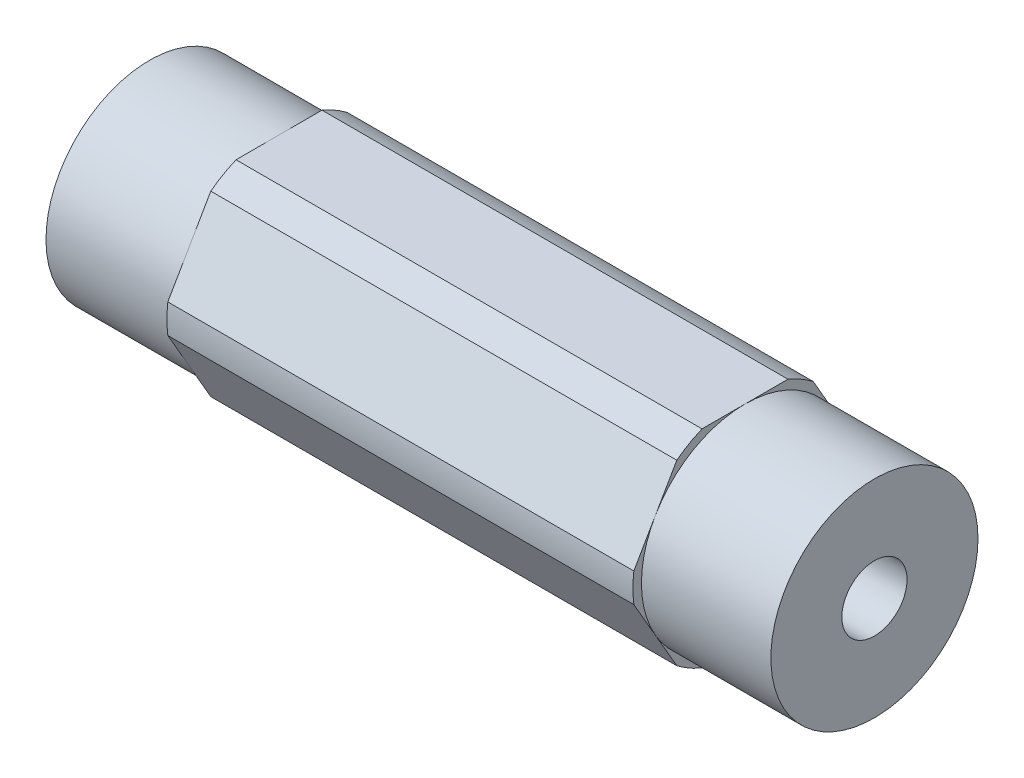
ISO-10303-21;
HEADER;
FILE_DESCRIPTION(('STEP AP214'),'2;1');
FILE_NAME('part.step','',(''),(''),'','','');
FILE_SCHEMA(('AUTOMOTIVE_DESIGN { 1 0 10303 214 1 1 1 1 }'));
ENDSEC;
DATA;
#1=APPLICATION_CONTEXT('core data for automotive mechanical design processes');
#2=APPLICATION_PROTOCOL_DEFINITION('international standard','automotive_design',2000,#1);
#3=PRODUCT_CONTEXT('',#1,'mechanical');
#4=PRODUCT('Part','Part','',(#3));
#5=PRODUCT_RELATED_PRODUCT_CATEGORY('part','',(#4));
#6=PRODUCT_DEFINITION_FORMATION('','',#4);
#7=PRODUCT_DEFINITION_CONTEXT('part definition',#1,'design');
#8=PRODUCT_DEFINITION('design','',#6,#7);
#9=PRODUCT_DEFINITION_SHAPE('','',#8);
#10=(LENGTH_UNIT() NAMED_UNIT(*) SI_UNIT(.MILLI.,.METRE.));
#11=(NAMED_UNIT(*) PLANE_ANGLE_UNIT() SI_UNIT($,.RADIAN.));
#12=(NAMED_UNIT(*) SI_UNIT($,.STERADIAN.) SOLID_ANGLE_UNIT());
#13=UNCERTAINTY_MEASURE_WITH_UNIT(LENGTH_MEASURE(1.E-05),#10,'distance_accuracy_value','');
#14=(GEOMETRIC_REPRESENTATION_CONTEXT(3) GLOBAL_UNCERTAINTY_ASSIGNED_CONTEXT((#13)) GLOBAL_UNIT_ASSIGNED_CONTEXT((#10,
#11,#12)) REPRESENTATION_CONTEXT('',''));
#15=CARTESIAN_POINT('',(0.,0.,0.));
#16=DIRECTION('',(0.,0.,1.));
#17=DIRECTION('',(1.,0.,0.));
#18=AXIS2_PLACEMENT_3D('',#15,#16,#17);
#19=CARTESIAN_POINT('',(22.225,0.,0.));
#20=DIRECTION('',(1.,0.,0.));
#21=DIRECTION('',(0.,0.,-1.));
#22=AXIS2_PLACEMENT_3D('',#19,#20,#21);
#23=PLANE('',#22);
#24=CARTESIAN_POINT('',(22.225,0.,0.));
#25=DIRECTION('',(1.,0.,0.));
#26=DIRECTION('',(0.,0.,-1.));
#27=AXIS2_PLACEMENT_3D('',#24,#25,#26);
#28=CIRCLE('',#27,2.000000064);
#29=CARTESIAN_POINT('',(22.225,0.,-2.000000064));
#30=VERTEX_POINT('',#29);
#31=EDGE_CURVE('E255',#30,#30,#28,.T.);
#32=ORIENTED_EDGE('',*,*,#31,.F.);
#33=EDGE_LOOP('',(#32));
#34=FACE_BOUND('',#33,.T.);
#35=CARTESIAN_POINT('',(22.225,0.,0.));
#36=DIRECTION('',(1.,0.,0.));
#37=DIRECTION('',(0.,0.,-1.));
#38=AXIS2_PLACEMENT_3D('',#35,#36,#37);
#39=CIRCLE('',#38,6.35);
#40=CARTESIAN_POINT('',(22.225,0.,-6.35));
#41=VERTEX_POINT('',#40);
#42=EDGE_CURVE('E57',#41,#41,#39,.F.);
#43=ORIENTED_EDGE('',*,*,#42,.F.);
#44=EDGE_LOOP('',(#43));
#45=FACE_BOUND('',#44,.T.);
#46=ADVANCED_FACE('F49',(#34,#45),#23,.T.);
#47=CARTESIAN_POINT('',(22.225,3.17499999999999,-5.49926131403116));
#48=DIRECTION('',(0.,-0.500000000000001,0.866025403784438));
#49=DIRECTION('',(0.,-0.866025403784438,-0.500000000000001));
#50=AXIS2_PLACEMENT_3D('',#47,#48,#49);
#51=PLANE('',#50);
#52=DIRECTION('',(-1.,0.,0.));
#53=VECTOR('',#52,1.);
#54=CARTESIAN_POINT('',(22.225,5.45696042896787,-4.18177084608648));
#55=LINE('',#54,#53);
#56=CARTESIAN_POINT('',(14.2875,5.45696042896787,-4.18177084608648));
#57=VERTEX_POINT('',#56);
#58=CARTESIAN_POINT('',(-14.2875,5.45696042896787,-4.18177084608648));
#59=VERTEX_POINT('',#58);
#60=EDGE_CURVE('E281',#57,#59,#55,.T.);
#61=ORIENTED_EDGE('',*,*,#60,.F.);
#62=DIRECTION('',(0.,-0.866025403784438,-0.500000000000001));
#63=VECTOR('',#62,1.);
#64=CARTESIAN_POINT('',(14.2875,3.17499999999999,-5.49926131403116));
#65=LINE('',#64,#63);
#66=CARTESIAN_POINT('',(14.2875,3.17500000000001,-5.49926131403118));
#67=VERTEX_POINT('',#66);
#68=EDGE_CURVE('E417',#57,#67,#65,.T.);
#69=ORIENTED_EDGE('',*,*,#68,.T.);
#70=CARTESIAN_POINT('',(14.2875,0.89303957103212,-6.81675178197584));
#71=VERTEX_POINT('',#70);
#72=EDGE_CURVE('E415',#67,#71,#65,.T.);
#73=ORIENTED_EDGE('',*,*,#72,.T.);
#74=DIRECTION('',(-1.,0.,0.));
#75=VECTOR('',#74,1.);
#76=CARTESIAN_POINT('',(22.225,0.89303957103212,-6.81675178197584));
#77=LINE('',#76,#75);
#78=CARTESIAN_POINT('',(-14.2875,0.89303957103212,-6.81675178197584));
#79=VERTEX_POINT('',#78);
#80=EDGE_CURVE('E71',#71,#79,#77,.T.);
#81=ORIENTED_EDGE('',*,*,#80,.T.);
#82=DIRECTION('',(0.,-0.866025403784438,-0.500000000000001));
#83=VECTOR('',#82,1.);
#84=CARTESIAN_POINT('',(-14.2875,3.17499999999999,-5.49926131403116));
#85=LINE('',#84,#83);
#86=CARTESIAN_POINT('',(-14.2875,3.17500000000001,-5.49926131403118));
#87=VERTEX_POINT('',#86);
#88=EDGE_CURVE('E223',#87,#79,#85,.T.);
#89=ORIENTED_EDGE('',*,*,#88,.F.);
#90=EDGE_CURVE('E226',#59,#87,#85,.T.);
#91=ORIENTED_EDGE('',*,*,#90,.F.);
#92=EDGE_LOOP('',(#61,#69,#73,#81,#89,#91));
#93=FACE_BOUND('',#92,.T.);
#94=ADVANCED_FACE('F292',(#93),#51,.F.);
#95=CARTESIAN_POINT('',(22.225,0.,0.));
#96=DIRECTION('',(-1.,0.,0.));
#97=DIRECTION('',(0.,0.,1.));
#98=AXIS2_PLACEMENT_3D('',#95,#96,#97);
#99=CYLINDRICAL_SURFACE('',#98,6.874999966);
#100=DIRECTION('',(-1.,0.,0.));
#101=VECTOR('',#100,1.);
#102=CARTESIAN_POINT('',(22.225,6.34999999999998,-2.63498093588933));
#103=LINE('',#102,#101);
#104=CARTESIAN_POINT('',(14.2875,6.34999999999999,-2.63498093588933));
#105=VERTEX_POINT('',#104);
#106=CARTESIAN_POINT('',(-14.2875,6.34999999999999,-2.63498093588933));
#107=VERTEX_POINT('',#106);
#108=EDGE_CURVE('E279',#105,#107,#103,.T.);
#109=ORIENTED_EDGE('',*,*,#108,.F.);
#110=CARTESIAN_POINT('',(14.2875,0.,0.));
#111=DIRECTION('',(-1.,0.,0.));
#112=DIRECTION('',(0.,0.,1.));
#113=AXIS2_PLACEMENT_3D('',#110,#111,#112);
#114=CIRCLE('',#113,6.874999966);
#115=EDGE_CURVE('E404',#105,#57,#114,.T.);
#116=ORIENTED_EDGE('',*,*,#115,.T.);
#117=ORIENTED_EDGE('',*,*,#60,.T.);
#118=CARTESIAN_POINT('',(-14.2875,0.,0.));
#119=DIRECTION('',(-1.,0.,0.));
#120=DIRECTION('',(0.,0.,1.));
#121=AXIS2_PLACEMENT_3D('',#118,#119,#120);
#122=CIRCLE('',#121,6.874999966);
#123=EDGE_CURVE('E232',#107,#59,#122,.T.);
#124=ORIENTED_EDGE('',*,*,#123,.F.);
#125=EDGE_LOOP('',(#109,#116,#117,#124));
#126=FACE_BOUND('',#125,.T.);
#127=ADVANCED_FACE('F298',(#126),#99,.T.);
#128=CARTESIAN_POINT('',(22.225,6.34999999999997,0.));
#129=DIRECTION('',(0.,-1.,0.));
#130=DIRECTION('',(0.,0.,-1.));
#131=AXIS2_PLACEMENT_3D('',#128,#129,#130);
#132=PLANE('',#131);
#133=DIRECTION('',(-1.,0.,0.));
#134=VECTOR('',#133,1.);
#135=CARTESIAN_POINT('',(22.225,6.34999999999997,2.63498093588937));
#136=LINE('',#135,#134);
#137=CARTESIAN_POINT('',(14.2875,6.34999999999997,2.63498093588937));
#138=VERTEX_POINT('',#137);
#139=CARTESIAN_POINT('',(-14.2875,6.34999999999997,2.63498093588937));
#140=VERTEX_POINT('',#139);
#141=EDGE_CURVE('E277',#138,#140,#136,.T.);
#142=ORIENTED_EDGE('',*,*,#141,.F.);
#143=DIRECTION('',(0.,0.,-1.));
#144=VECTOR('',#143,1.);
#145=CARTESIAN_POINT('',(14.2875,6.34999999999997,0.));
#146=LINE('',#145,#144);
#147=CARTESIAN_POINT('',(14.2875,6.35,0.));
#148=VERTEX_POINT('',#147);
#149=EDGE_CURVE('E340',#138,#148,#146,.T.);
#150=ORIENTED_EDGE('',*,*,#149,.T.);
#151=EDGE_CURVE('E396',#148,#105,#146,.T.);
#152=ORIENTED_EDGE('',*,*,#151,.T.);
#153=ORIENTED_EDGE('',*,*,#108,.T.);
#154=DIRECTION('',(0.,0.,-1.));
#155=VECTOR('',#154,1.);
#156=CARTESIAN_POINT('',(-14.2875,6.34999999999997,0.));
#157=LINE('',#156,#155);
#158=CARTESIAN_POINT('',(-14.2875,6.35,0.));
#159=VERTEX_POINT('',#158);
#160=EDGE_CURVE('E241',#159,#107,#157,.T.);
#161=ORIENTED_EDGE('',*,*,#160,.F.);
#162=EDGE_CURVE('E245',#140,#159,#157,.T.);
#163=ORIENTED_EDGE('',*,*,#162,.F.);
#164=EDGE_LOOP('',(#142,#150,#152,#153,#161,#163));
#165=FACE_BOUND('',#164,.T.);
#166=ADVANCED_FACE('F311',(#165),#132,.F.);
#167=DIRECTION('',(-1.,0.,0.));
#168=VECTOR('',#167,1.);
#169=CARTESIAN_POINT('',(22.225,5.45696042896784,4.18177084608652));
#170=LINE('',#169,#168);
#171=CARTESIAN_POINT('',(14.2875,5.45696042896784,4.18177084608652));
#172=VERTEX_POINT('',#171);
#173=CARTESIAN_POINT('',(-14.2875,5.45696042896784,4.18177084608652));
#174=VERTEX_POINT('',#173);
#175=EDGE_CURVE('E275',#172,#174,#170,.T.);
#176=ORIENTED_EDGE('',*,*,#175,.F.);
#177=CARTESIAN_POINT('',(14.2875,0.,0.));
#178=DIRECTION('',(-1.,0.,0.));
#179=DIRECTION('',(0.,0.,1.));
#180=AXIS2_PLACEMENT_3D('',#177,#178,#179);
#181=CIRCLE('',#180,6.874999966);
#182=EDGE_CURVE('E183',#172,#138,#181,.T.);
#183=ORIENTED_EDGE('',*,*,#182,.T.);
#184=ORIENTED_EDGE('',*,*,#141,.T.);
#185=CARTESIAN_POINT('',(-14.2875,0.,0.));
#186=DIRECTION('',(-1.,0.,0.));
#187=DIRECTION('',(0.,0.,1.));
#188=AXIS2_PLACEMENT_3D('',#185,#186,#187);
#189=CIRCLE('',#188,6.874999966);
#190=EDGE_CURVE('E251',#174,#140,#189,.T.);
#191=ORIENTED_EDGE('',*,*,#190,.F.);
#192=EDGE_LOOP('',(#176,#183,#184,#191));
#193=FACE_BOUND('',#192,.T.);
#194=ADVANCED_FACE('F313',(#193),#99,.T.);
#195=CARTESIAN_POINT('',(22.225,3.17499999999996,5.49926131403118));
#196=DIRECTION('',(0.,-0.499999999999995,-0.866025403784441));
#197=DIRECTION('',(0.,0.866025403784442,-0.499999999999995));
#198=AXIS2_PLACEMENT_3D('',#195,#196,#197);
#199=PLANE('',#198);
#200=DIRECTION('',(-1.,0.,0.));
#201=VECTOR('',#200,1.);
#202=CARTESIAN_POINT('',(22.225,0.893039571032071,6.81675178197585));
#203=LINE('',#202,#201);
#204=CARTESIAN_POINT('',(14.2875,0.893039571032071,6.81675178197584));
#205=VERTEX_POINT('',#204);
#206=CARTESIAN_POINT('',(-14.2875,0.893039571032071,6.81675178197584));
#207=VERTEX_POINT('',#206);
#208=EDGE_CURVE('E211',#205,#207,#203,.T.);
#209=ORIENTED_EDGE('',*,*,#208,.F.);
#210=DIRECTION('',(0.,0.866025403784442,-0.499999999999995));
#211=VECTOR('',#210,1.);
#212=CARTESIAN_POINT('',(14.2875,3.17499999999996,5.49926131403118));
#213=LINE('',#212,#211);
#214=CARTESIAN_POINT('',(14.2875,3.17499999999997,5.4992613140312));
#215=VERTEX_POINT('',#214);
#216=EDGE_CURVE('E189',#205,#215,#213,.T.);
#217=ORIENTED_EDGE('',*,*,#216,.T.);
#218=EDGE_CURVE('E176',#215,#172,#213,.T.);
#219=ORIENTED_EDGE('',*,*,#218,.T.);
#220=ORIENTED_EDGE('',*,*,#175,.T.);
#221=DIRECTION('',(0.,0.866025403784442,-0.499999999999995));
#222=VECTOR('',#221,1.);
#223=CARTESIAN_POINT('',(-14.2875,3.17499999999996,5.49926131403118));
#224=LINE('',#223,#222);
#225=CARTESIAN_POINT('',(-14.2875,3.17499999999997,5.4992613140312));
#226=VERTEX_POINT('',#225);
#227=EDGE_CURVE('E252',#226,#174,#224,.T.);
#228=ORIENTED_EDGE('',*,*,#227,.F.);
#229=EDGE_CURVE('E249',#207,#226,#224,.T.);
#230=ORIENTED_EDGE('',*,*,#229,.F.);
#231=EDGE_LOOP('',(#209,#217,#219,#220,#228,#230));
#232=FACE_BOUND('',#231,.T.);
#233=ADVANCED_FACE('F209',(#232),#199,.F.);
#234=DIRECTION('',(-1.,0.,0.));
#235=VECTOR('',#234,1.);
#236=CARTESIAN_POINT('',(22.225,-0.893039571032169,6.81675178197583));
#237=LINE('',#236,#235);
#238=CARTESIAN_POINT('',(14.2875,-0.893039571032169,6.81675178197583));
#239=VERTEX_POINT('',#238);
#240=CARTESIAN_POINT('',(-14.2875,-0.893039571032169,6.81675178197583));
#241=VERTEX_POINT('',#240);
#242=EDGE_CURVE('E272',#239,#241,#237,.T.);
#243=ORIENTED_EDGE('',*,*,#242,.F.);
#244=CARTESIAN_POINT('',(14.2875,0.,0.));
#245=DIRECTION('',(-1.,0.,0.));
#246=DIRECTION('',(0.,0.,1.));
#247=AXIS2_PLACEMENT_3D('',#244,#245,#246);
#248=CIRCLE('',#247,6.874999966);
#249=EDGE_CURVE('E212',#239,#205,#248,.T.);
#250=ORIENTED_EDGE('',*,*,#249,.T.);
#251=ORIENTED_EDGE('',*,*,#208,.T.);
#252=CARTESIAN_POINT('',(-14.2875,0.,0.));
#253=DIRECTION('',(-1.,0.,0.));
#254=DIRECTION('',(0.,0.,1.));
#255=AXIS2_PLACEMENT_3D('',#252,#253,#254);
#256=CIRCLE('',#255,6.874999966);
#257=EDGE_CURVE('E246',#241,#207,#256,.T.);
#258=ORIENTED_EDGE('',*,*,#257,.F.);
#259=EDGE_LOOP('',(#243,#250,#251,#258));
#260=FACE_BOUND('',#259,.T.);
#261=ADVANCED_FACE('F327',(#260),#99,.T.);
#262=CARTESIAN_POINT('',(22.225,-3.17500000000003,5.49926131403114));
#263=DIRECTION('',(0.,0.500000000000007,-0.866025403784434));
#264=DIRECTION('',(0.,0.866025403784435,0.500000000000007));
#265=AXIS2_PLACEMENT_3D('',#262,#263,#264);
#266=PLANE('',#265);
#267=DIRECTION('',(-1.,0.,0.));
#268=VECTOR('',#267,1.);
#269=CARTESIAN_POINT('',(22.225,-5.4569604289679,4.18177084608644));
#270=LINE('',#269,#268);
#271=CARTESIAN_POINT('',(14.2875,-5.4569604289679,4.18177084608644));
#272=VERTEX_POINT('',#271);
#273=CARTESIAN_POINT('',(-14.2875,-5.4569604289679,4.18177084608644));
#274=VERTEX_POINT('',#273);
#275=EDGE_CURVE('E270',#272,#274,#270,.T.);
#276=ORIENTED_EDGE('',*,*,#275,.F.);
#277=DIRECTION('',(0.,0.866025403784435,0.500000000000007));
#278=VECTOR('',#277,1.);
#279=CARTESIAN_POINT('',(14.2875,-3.17500000000003,5.49926131403114));
#280=LINE('',#279,#278);
#281=CARTESIAN_POINT('',(14.2875,-3.17500000000004,5.49926131403116));
#282=VERTEX_POINT('',#281);
#283=EDGE_CURVE('E394',#272,#282,#280,.T.);
#284=ORIENTED_EDGE('',*,*,#283,.T.);
#285=EDGE_CURVE('E196',#282,#239,#280,.T.);
#286=ORIENTED_EDGE('',*,*,#285,.T.);
#287=ORIENTED_EDGE('',*,*,#242,.T.);
#288=DIRECTION('',(0.,0.866025403784435,0.500000000000007));
#289=VECTOR('',#288,1.);
#290=CARTESIAN_POINT('',(-14.2875,-3.17500000000003,5.49926131403114));
#291=LINE('',#290,#289);
#292=CARTESIAN_POINT('',(-14.2875,-3.17500000000004,5.49926131403116));
#293=VERTEX_POINT('',#292);
#294=EDGE_CURVE('E242',#293,#241,#291,.T.);
#295=ORIENTED_EDGE('',*,*,#294,.F.);
#296=EDGE_CURVE('E239',#274,#293,#291,.T.);
#297=ORIENTED_EDGE('',*,*,#296,.F.);
#298=EDGE_LOOP('',(#276,#284,#286,#287,#295,#297));
#299=FACE_BOUND('',#298,.T.);
#300=ADVANCED_FACE('F324',(#299),#266,.F.);
#301=DIRECTION('',(-1.,0.,0.));
#302=VECTOR('',#301,1.);
#303=CARTESIAN_POINT('',(22.225,-6.35,2.63498093588929));
#304=LINE('',#303,#302);
#305=CARTESIAN_POINT('',(14.2875,-6.35,2.63498093588929));
#306=VERTEX_POINT('',#305);
#307=CARTESIAN_POINT('',(-14.2875,-6.35,2.63498093588929));
#308=VERTEX_POINT('',#307);
#309=EDGE_CURVE('E268',#306,#308,#304,.T.);
#310=ORIENTED_EDGE('',*,*,#309,.F.);
#311=CARTESIAN_POINT('',(14.2875,0.,0.));
#312=DIRECTION('',(-1.,0.,0.));
#313=DIRECTION('',(0.,0.,1.));
#314=AXIS2_PLACEMENT_3D('',#311,#312,#313);
#315=CIRCLE('',#314,6.874999966);
#316=EDGE_CURVE('E398',#306,#272,#315,.T.);
#317=ORIENTED_EDGE('',*,*,#316,.T.);
#318=ORIENTED_EDGE('',*,*,#275,.T.);
#319=CARTESIAN_POINT('',(-14.2875,0.,0.));
#320=DIRECTION('',(-1.,0.,0.));
#321=DIRECTION('',(0.,0.,1.));
#322=AXIS2_PLACEMENT_3D('',#319,#320,#321);
#323=CIRCLE('',#322,6.874999966);
#324=EDGE_CURVE('E236',#308,#274,#323,.T.);
#325=ORIENTED_EDGE('',*,*,#324,.F.);
#326=EDGE_LOOP('',(#310,#317,#318,#325));
#327=FACE_BOUND('',#326,.T.);
#328=ADVANCED_FACE('F322',(#327),#99,.T.);
#329=CARTESIAN_POINT('',(22.225,-6.34999999999997,0.));
#330=DIRECTION('',(0.,1.,0.));
#331=DIRECTION('',(0.,0.,1.));
#332=AXIS2_PLACEMENT_3D('',#329,#330,#331);
#333=PLANE('',#332);
#334=DIRECTION('',(-1.,0.,0.));
#335=VECTOR('',#334,1.);
#336=CARTESIAN_POINT('',(22.225,-6.34999999999995,-2.63498093588942));
#337=LINE('',#336,#335);
#338=CARTESIAN_POINT('',(14.2875,-6.34999999999995,-2.63498093588942));
#339=VERTEX_POINT('',#338);
#340=CARTESIAN_POINT('',(-14.2875,-6.34999999999995,-2.63498093588942));
#341=VERTEX_POINT('',#340);
#342=EDGE_CURVE('E266',#339,#341,#337,.T.);
#343=ORIENTED_EDGE('',*,*,#342,.F.);
#344=DIRECTION('',(0.,0.,1.));
#345=VECTOR('',#344,1.);
#346=CARTESIAN_POINT('',(14.2875,-6.34999999999997,0.));
#347=LINE('',#346,#345);
#348=CARTESIAN_POINT('',(14.2875,-6.35,0.));
#349=VERTEX_POINT('',#348);
#350=EDGE_CURVE('E406',#339,#349,#347,.T.);
#351=ORIENTED_EDGE('',*,*,#350,.T.);
#352=EDGE_CURVE('E400',#349,#306,#347,.T.);
#353=ORIENTED_EDGE('',*,*,#352,.T.);
#354=ORIENTED_EDGE('',*,*,#309,.T.);
#355=DIRECTION('',(0.,0.,1.));
#356=VECTOR('',#355,1.);
#357=CARTESIAN_POINT('',(-14.2875,-6.34999999999997,0.));
#358=LINE('',#357,#356);
#359=CARTESIAN_POINT('',(-14.2875,-6.35,0.));
#360=VERTEX_POINT('',#359);
#361=EDGE_CURVE('E233',#360,#308,#358,.T.);
#362=ORIENTED_EDGE('',*,*,#361,.F.);
#363=EDGE_CURVE('E230',#341,#360,#358,.T.);
#364=ORIENTED_EDGE('',*,*,#363,.F.);
#365=EDGE_LOOP('',(#343,#351,#353,#354,#362,#364));
#366=FACE_BOUND('',#365,.T.);
#367=ADVANCED_FACE('F319',(#366),#333,.F.);
#368=DIRECTION('',(-1.,0.,0.));
#369=VECTOR('',#368,1.);
#370=CARTESIAN_POINT('',(22.225,-5.4569604289678,-4.18177084608657));
#371=LINE('',#370,#369);
#372=CARTESIAN_POINT('',(14.2875,-5.4569604289678,-4.18177084608657));
#373=VERTEX_POINT('',#372);
#374=CARTESIAN_POINT('',(-14.2875,-5.4569604289678,-4.18177084608657));
#375=VERTEX_POINT('',#374);
#376=EDGE_CURVE('E264',#373,#375,#371,.T.);
#377=ORIENTED_EDGE('',*,*,#376,.F.);
#378=CARTESIAN_POINT('',(14.2875,0.,0.));
#379=DIRECTION('',(-1.,0.,0.));
#380=DIRECTION('',(0.,0.,1.));
#381=AXIS2_PLACEMENT_3D('',#378,#379,#380);
#382=CIRCLE('',#381,6.874999966);
#383=EDGE_CURVE('E411',#373,#339,#382,.T.);
#384=ORIENTED_EDGE('',*,*,#383,.T.);
#385=ORIENTED_EDGE('',*,*,#342,.T.);
#386=CARTESIAN_POINT('',(-14.2875,0.,0.));
#387=DIRECTION('',(-1.,0.,0.));
#388=DIRECTION('',(0.,0.,1.));
#389=AXIS2_PLACEMENT_3D('',#386,#387,#388);
#390=CIRCLE('',#389,6.874999966);
#391=EDGE_CURVE('E227',#375,#341,#390,.T.);
#392=ORIENTED_EDGE('',*,*,#391,.F.);
#393=EDGE_LOOP('',(#377,#384,#385,#392));
#394=FACE_BOUND('',#393,.T.);
#395=ADVANCED_FACE('F317',(#394),#99,.T.);
#396=CARTESIAN_POINT('',(22.225,-3.17499999999997,-5.4992613140312));
#397=DIRECTION('',(0.,0.499999999999995,0.866025403784441));
#398=DIRECTION('',(0.,-0.866025403784442,0.499999999999995));
#399=AXIS2_PLACEMENT_3D('',#396,#397,#398);
#400=PLANE('',#399);
#401=DIRECTION('',(-1.,0.,0.));
#402=VECTOR('',#401,1.);
#403=CARTESIAN_POINT('',(22.225,-0.893039571032136,-6.81675178197584));
#404=LINE('',#403,#402);
#405=CARTESIAN_POINT('',(14.2875,-0.893039571032136,-6.81675178197584));
#406=VERTEX_POINT('',#405);
#407=CARTESIAN_POINT('',(-14.2875,-0.893039571032136,-6.81675178197584));
#408=VERTEX_POINT('',#407);
#409=EDGE_CURVE('E262',#406,#408,#404,.T.);
#410=ORIENTED_EDGE('',*,*,#409,.F.);
#411=DIRECTION('',(0.,-0.866025403784442,0.499999999999995));
#412=VECTOR('',#411,1.);
#413=CARTESIAN_POINT('',(14.2875,-3.17499999999997,-5.4992613140312));
#414=LINE('',#413,#412);
#415=CARTESIAN_POINT('',(14.2875,-3.17499999999997,-5.4992613140312));
#416=VERTEX_POINT('',#415);
#417=EDGE_CURVE('E64',#406,#416,#414,.T.);
#418=ORIENTED_EDGE('',*,*,#417,.T.);
#419=EDGE_CURVE('E414',#416,#373,#414,.T.);
#420=ORIENTED_EDGE('',*,*,#419,.T.);
#421=ORIENTED_EDGE('',*,*,#376,.T.);
#422=DIRECTION('',(0.,-0.866025403784442,0.499999999999995));
#423=VECTOR('',#422,1.);
#424=CARTESIAN_POINT('',(-14.2875,-3.17499999999997,-5.4992613140312));
#425=LINE('',#424,#423);
#426=CARTESIAN_POINT('',(-14.2875,-3.17499999999997,-5.4992613140312));
#427=VERTEX_POINT('',#426);
#428=EDGE_CURVE('E224',#427,#375,#425,.T.);
#429=ORIENTED_EDGE('',*,*,#428,.F.);
#430=EDGE_CURVE('E220',#408,#427,#425,.T.);
#431=ORIENTED_EDGE('',*,*,#430,.F.);
#432=EDGE_LOOP('',(#410,#418,#420,#421,#429,#431));
#433=FACE_BOUND('',#432,.T.);
#434=ADVANCED_FACE('F314',(#433),#400,.F.);
#435=ORIENTED_EDGE('',*,*,#80,.F.);
#436=CARTESIAN_POINT('',(14.2875,0.,0.));
#437=DIRECTION('',(-1.,0.,0.));
#438=DIRECTION('',(0.,0.,1.));
#439=AXIS2_PLACEMENT_3D('',#436,#437,#438);
#440=CIRCLE('',#439,6.874999966);
#441=EDGE_CURVE('E12',#71,#406,#440,.T.);
#442=ORIENTED_EDGE('',*,*,#441,.T.);
#443=ORIENTED_EDGE('',*,*,#409,.T.);
#444=CARTESIAN_POINT('',(-14.2875,0.,0.));
#445=DIRECTION('',(-1.,0.,0.));
#446=DIRECTION('',(0.,0.,1.));
#447=AXIS2_PLACEMENT_3D('',#444,#445,#446);
#448=CIRCLE('',#447,6.874999966);
#449=EDGE_CURVE('E286',#79,#408,#448,.T.);
#450=ORIENTED_EDGE('',*,*,#449,.F.);
#451=EDGE_LOOP('',(#435,#442,#443,#450));
#452=FACE_BOUND('',#451,.T.);
#453=ADVANCED_FACE('F307',(#452),#99,.T.);
#454=CARTESIAN_POINT('',(-22.225,0.,0.));
#455=DIRECTION('',(1.,0.,0.));
#456=DIRECTION('',(0.,0.,-1.));
#457=AXIS2_PLACEMENT_3D('',#454,#455,#456);
#458=PLANE('',#457);
#459=CARTESIAN_POINT('',(-22.225,0.,0.));
#460=DIRECTION('',(1.,0.,0.));
#461=DIRECTION('',(0.,0.,-1.));
#462=AXIS2_PLACEMENT_3D('',#459,#460,#461);
#463=CIRCLE('',#462,2.000000064);
#464=CARTESIAN_POINT('',(-22.225,0.,-2.000000064));
#465=VERTEX_POINT('',#464);
#466=EDGE_CURVE('E258',#465,#465,#463,.T.);
#467=ORIENTED_EDGE('',*,*,#466,.T.);
#468=EDGE_LOOP('',(#467));
#469=FACE_BOUND('',#468,.T.);
#470=CARTESIAN_POINT('',(-22.225,0.,0.));
#471=DIRECTION('',(1.,0.,0.));
#472=DIRECTION('',(0.,0.,-1.));
#473=AXIS2_PLACEMENT_3D('',#470,#471,#472);
#474=CIRCLE('',#473,6.35);
#475=CARTESIAN_POINT('',(-22.225,0.,-6.35));
#476=VERTEX_POINT('',#475);
#477=EDGE_CURVE('E283',#476,#476,#474,.T.);
#478=ORIENTED_EDGE('',*,*,#477,.F.);
#479=EDGE_LOOP('',(#478));
#480=FACE_BOUND('',#479,.T.);
#481=ADVANCED_FACE('F304',(#469,#480),#458,.F.);
#482=CARTESIAN_POINT('',(22.225,0.,0.));
#483=DIRECTION('',(-1.,0.,0.));
#484=DIRECTION('',(0.,0.,1.));
#485=AXIS2_PLACEMENT_3D('',#482,#483,#484);
#486=CYLINDRICAL_SURFACE('',#485,2.000000064);
#487=ORIENTED_EDGE('',*,*,#31,.T.);
#488=EDGE_LOOP('',(#487));
#489=FACE_BOUND('',#488,.T.);
#490=ORIENTED_EDGE('',*,*,#466,.F.);
#491=EDGE_LOOP('',(#490));
#492=FACE_BOUND('',#491,.T.);
#493=ADVANCED_FACE('F51',(#489,#492),#486,.F.);
#494=CARTESIAN_POINT('',(-14.2875,0.,0.));
#495=DIRECTION('',(-1.,0.,0.));
#496=DIRECTION('',(0.,0.,1.));
#497=AXIS2_PLACEMENT_3D('',#494,#495,#496);
#498=PLANE('',#497);
#499=ORIENTED_EDGE('',*,*,#227,.T.);
#500=ORIENTED_EDGE('',*,*,#190,.T.);
#501=ORIENTED_EDGE('',*,*,#162,.T.);
#502=CARTESIAN_POINT('',(-14.2875,0.,0.));
#503=DIRECTION('',(-1.,0.,0.));
#504=DIRECTION('',(0.,0.,1.));
#505=AXIS2_PLACEMENT_3D('',#502,#503,#504);
#506=CIRCLE('',#505,6.35);
#507=EDGE_CURVE('E217',#226,#159,#506,.T.);
#508=ORIENTED_EDGE('',*,*,#507,.F.);
#509=EDGE_LOOP('',(#499,#500,#501,#508));
#510=FACE_BOUND('',#509,.T.);
#511=ADVANCED_FACE('F302',(#510),#498,.T.);
#512=ORIENTED_EDGE('',*,*,#229,.T.);
#513=EDGE_CURVE('E187',#293,#226,#506,.T.);
#514=ORIENTED_EDGE('',*,*,#513,.F.);
#515=ORIENTED_EDGE('',*,*,#294,.T.);
#516=ORIENTED_EDGE('',*,*,#257,.T.);
#517=EDGE_LOOP('',(#512,#514,#515,#516));
#518=FACE_BOUND('',#517,.T.);
#519=ADVANCED_FACE('F351',(#518),#498,.T.);
#520=ORIENTED_EDGE('',*,*,#160,.T.);
#521=ORIENTED_EDGE('',*,*,#123,.T.);
#522=ORIENTED_EDGE('',*,*,#90,.T.);
#523=EDGE_CURVE('E221',#159,#87,#506,.T.);
#524=ORIENTED_EDGE('',*,*,#523,.F.);
#525=EDGE_LOOP('',(#520,#521,#522,#524));
#526=FACE_BOUND('',#525,.T.);
#527=ADVANCED_FACE('F424',(#526),#498,.T.);
#528=ORIENTED_EDGE('',*,*,#296,.T.);
#529=EDGE_CURVE('E360',#360,#293,#506,.T.);
#530=ORIENTED_EDGE('',*,*,#529,.F.);
#531=ORIENTED_EDGE('',*,*,#361,.T.);
#532=ORIENTED_EDGE('',*,*,#324,.T.);
#533=EDGE_LOOP('',(#528,#530,#531,#532));
#534=FACE_BOUND('',#533,.T.);
#535=ADVANCED_FACE('F387',(#534),#498,.T.);
#536=ORIENTED_EDGE('',*,*,#363,.T.);
#537=EDGE_CURVE('E362',#427,#360,#506,.T.);
#538=ORIENTED_EDGE('',*,*,#537,.F.);
#539=ORIENTED_EDGE('',*,*,#428,.T.);
#540=ORIENTED_EDGE('',*,*,#391,.T.);
#541=EDGE_LOOP('',(#536,#538,#539,#540));
#542=FACE_BOUND('',#541,.T.);
#543=ADVANCED_FACE('F381',(#542),#498,.T.);
#544=ORIENTED_EDGE('',*,*,#88,.T.);
#545=ORIENTED_EDGE('',*,*,#449,.T.);
#546=ORIENTED_EDGE('',*,*,#430,.T.);
#547=EDGE_CURVE('E363',#87,#427,#506,.T.);
#548=ORIENTED_EDGE('',*,*,#547,.F.);
#549=EDGE_LOOP('',(#544,#545,#546,#548));
#550=FACE_BOUND('',#549,.T.);
#551=ADVANCED_FACE('F374',(#550),#498,.T.);
#552=CARTESIAN_POINT('',(-14.2875,0.,0.));
#553=DIRECTION('',(-1.,0.,0.));
#554=DIRECTION('',(0.,0.,1.));
#555=AXIS2_PLACEMENT_3D('',#552,#553,#554);
#556=CYLINDRICAL_SURFACE('',#555,6.35);
#557=ORIENTED_EDGE('',*,*,#477,.T.);
#558=EDGE_LOOP('',(#557));
#559=FACE_BOUND('',#558,.T.);
#560=ORIENTED_EDGE('',*,*,#523,.T.);
#561=ORIENTED_EDGE('',*,*,#547,.T.);
#562=ORIENTED_EDGE('',*,*,#537,.T.);
#563=ORIENTED_EDGE('',*,*,#529,.T.);
#564=ORIENTED_EDGE('',*,*,#513,.T.);
#565=ORIENTED_EDGE('',*,*,#507,.T.);
#566=EDGE_LOOP('',(#560,#561,#562,#563,#564,#565));
#567=FACE_BOUND('',#566,.T.);
#568=ADVANCED_FACE('F357',(#559,#567),#556,.T.);
#569=CARTESIAN_POINT('',(14.2875,0.,0.));
#570=DIRECTION('',(-1.,0.,0.));
#571=DIRECTION('',(0.,0.,1.));
#572=AXIS2_PLACEMENT_3D('',#569,#570,#571);
#573=PLANE('',#572);
#574=CARTESIAN_POINT('',(14.2875,0.,0.));
#575=DIRECTION('',(-1.,0.,0.));
#576=DIRECTION('',(0.,0.,1.));
#577=AXIS2_PLACEMENT_3D('',#574,#575,#576);
#578=CIRCLE('',#577,6.35);
#579=EDGE_CURVE('E180',#215,#148,#578,.T.);
#580=ORIENTED_EDGE('',*,*,#579,.T.);
#581=ORIENTED_EDGE('',*,*,#149,.F.);
#582=ORIENTED_EDGE('',*,*,#182,.F.);
#583=ORIENTED_EDGE('',*,*,#218,.F.);
#584=EDGE_LOOP('',(#580,#581,#582,#583));
#585=FACE_BOUND('',#584,.T.);
#586=ADVANCED_FACE('F178',(#585),#573,.F.);
#587=ORIENTED_EDGE('',*,*,#249,.F.);
#588=ORIENTED_EDGE('',*,*,#285,.F.);
#589=EDGE_CURVE('E192',#282,#215,#578,.T.);
#590=ORIENTED_EDGE('',*,*,#589,.T.);
#591=ORIENTED_EDGE('',*,*,#216,.F.);
#592=EDGE_LOOP('',(#587,#588,#590,#591));
#593=FACE_BOUND('',#592,.T.);
#594=ADVANCED_FACE('F193',(#593),#573,.F.);
#595=EDGE_CURVE('E207',#148,#67,#578,.T.);
#596=ORIENTED_EDGE('',*,*,#595,.T.);
#597=ORIENTED_EDGE('',*,*,#68,.F.);
#598=ORIENTED_EDGE('',*,*,#115,.F.);
#599=ORIENTED_EDGE('',*,*,#151,.F.);
#600=EDGE_LOOP('',(#596,#597,#598,#599));
#601=FACE_BOUND('',#600,.T.);
#602=ADVANCED_FACE('F421',(#601),#573,.F.);
#603=ORIENTED_EDGE('',*,*,#316,.F.);
#604=ORIENTED_EDGE('',*,*,#352,.F.);
#605=EDGE_CURVE('E200',#349,#282,#578,.T.);
#606=ORIENTED_EDGE('',*,*,#605,.T.);
#607=ORIENTED_EDGE('',*,*,#283,.F.);
#608=EDGE_LOOP('',(#603,#604,#606,#607));
#609=FACE_BOUND('',#608,.T.);
#610=ADVANCED_FACE('F568',(#609),#573,.F.);
#611=ORIENTED_EDGE('',*,*,#383,.F.);
#612=ORIENTED_EDGE('',*,*,#419,.F.);
#613=EDGE_CURVE('E610',#416,#349,#578,.T.);
#614=ORIENTED_EDGE('',*,*,#613,.T.);
#615=ORIENTED_EDGE('',*,*,#350,.F.);
#616=EDGE_LOOP('',(#611,#612,#614,#615));
#617=FACE_BOUND('',#616,.T.);
#618=ADVANCED_FACE('F574',(#617),#573,.F.);
#619=EDGE_CURVE('E608',#67,#416,#578,.T.);
#620=ORIENTED_EDGE('',*,*,#619,.T.);
#621=ORIENTED_EDGE('',*,*,#417,.F.);
#622=ORIENTED_EDGE('',*,*,#441,.F.);
#623=ORIENTED_EDGE('',*,*,#72,.F.);
#624=EDGE_LOOP('',(#620,#621,#622,#623));
#625=FACE_BOUND('',#624,.T.);
#626=ADVANCED_FACE('F558',(#625),#573,.F.);
#627=CARTESIAN_POINT('',(14.2875,0.,0.));
#628=DIRECTION('',(1.,0.,0.));
#629=DIRECTION('',(0.,0.,-1.));
#630=AXIS2_PLACEMENT_3D('',#627,#628,#629);
#631=CYLINDRICAL_SURFACE('',#630,6.35);
#632=ORIENTED_EDGE('',*,*,#619,.F.);
#633=ORIENTED_EDGE('',*,*,#595,.F.);
#634=ORIENTED_EDGE('',*,*,#579,.F.);
#635=ORIENTED_EDGE('',*,*,#589,.F.);
#636=ORIENTED_EDGE('',*,*,#605,.F.);
#637=ORIENTED_EDGE('',*,*,#613,.F.);
#638=EDGE_LOOP('',(#632,#633,#634,#635,#636,#637));
#639=FACE_BOUND('',#638,.T.);
#640=ORIENTED_EDGE('',*,*,#42,.T.);
#641=EDGE_LOOP('',(#640));
#642=FACE_BOUND('',#641,.T.);
#643=ADVANCED_FACE('F204',(#639,#642),#631,.T.);
#644=CLOSED_SHELL('',(#46,#94,#127,#166,#194,#233,#261,#300,#328,#367,#395,#434,#453,#481,#493,
#511,#519,#527,#535,#543,#551,#568,#586,#594,#602,#610,#618,#626,#643));
#645=MANIFOLD_SOLID_BREP('B2',#644);
#646=ADVANCED_BREP_SHAPE_REPRESENTATION('',(#18,#645),#14);
#647=SHAPE_DEFINITION_REPRESENTATION(#9,#646);
ENDSEC;
END-ISO-10303-21;
